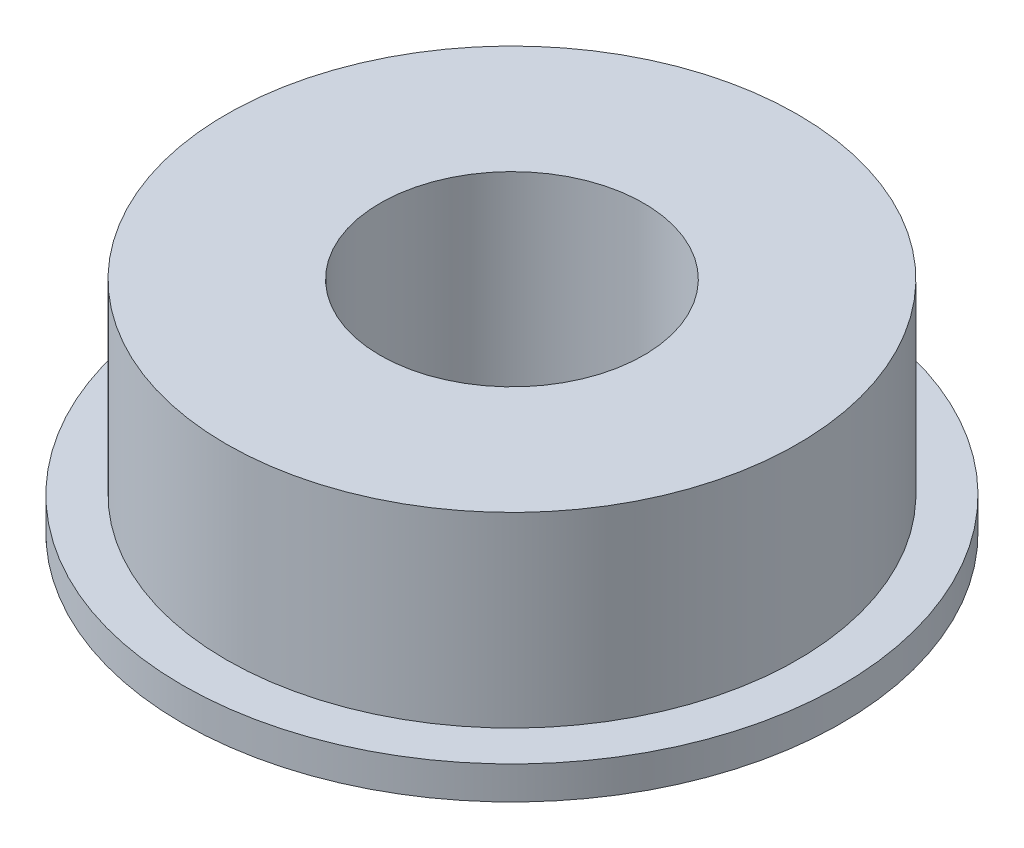
ISO-10303-21;
HEADER;
FILE_DESCRIPTION(('STEP AP214'),'2;1');
FILE_NAME('part.step','',(''),(''),'','','');
FILE_SCHEMA(('AUTOMOTIVE_DESIGN { 1 0 10303 214 1 1 1 1 }'));
ENDSEC;
DATA;
#1=APPLICATION_CONTEXT('core data for automotive mechanical design processes');
#2=APPLICATION_PROTOCOL_DEFINITION('international standard','automotive_design',2000,#1);
#3=PRODUCT_CONTEXT('',#1,'mechanical');
#4=PRODUCT('Part','Part','',(#3));
#5=PRODUCT_RELATED_PRODUCT_CATEGORY('part','',(#4));
#6=PRODUCT_DEFINITION_FORMATION('','',#4);
#7=PRODUCT_DEFINITION_CONTEXT('part definition',#1,'design');
#8=PRODUCT_DEFINITION('design','',#6,#7);
#9=PRODUCT_DEFINITION_SHAPE('','',#8);
#10=(LENGTH_UNIT() NAMED_UNIT(*) SI_UNIT(.MILLI.,.METRE.));
#11=(NAMED_UNIT(*) PLANE_ANGLE_UNIT() SI_UNIT($,.RADIAN.));
#12=(NAMED_UNIT(*) SI_UNIT($,.STERADIAN.) SOLID_ANGLE_UNIT());
#13=UNCERTAINTY_MEASURE_WITH_UNIT(LENGTH_MEASURE(1.E-05),#10,'distance_accuracy_value','');
#14=(GEOMETRIC_REPRESENTATION_CONTEXT(3) GLOBAL_UNCERTAINTY_ASSIGNED_CONTEXT((#13)) GLOBAL_UNIT_ASSIGNED_CONTEXT((#10,
#11,#12)) REPRESENTATION_CONTEXT('',''));
#15=CARTESIAN_POINT('',(0.,0.,0.));
#16=DIRECTION('',(0.,0.,1.));
#17=DIRECTION('',(1.,0.,0.));
#18=AXIS2_PLACEMENT_3D('',#15,#16,#17);
#19=CARTESIAN_POINT('',(0.,133.35,0.));
#20=DIRECTION('',(0.,1.,0.));
#21=DIRECTION('',(0.,0.,1.));
#22=AXIS2_PLACEMENT_3D('',#19,#20,#21);
#23=CYLINDRICAL_SURFACE('',#22,3.);
#24=CARTESIAN_POINT('',(0.,0.,0.));
#25=DIRECTION('',(0.,1.,0.));
#26=DIRECTION('',(0.,0.,1.));
#27=AXIS2_PLACEMENT_3D('',#24,#25,#26);
#28=CIRCLE('',#27,3.);
#29=CARTESIAN_POINT('',(0.,0.,3.));
#30=VERTEX_POINT('',#29);
#31=EDGE_CURVE('E10',#30,#30,#28,.T.);
#32=ORIENTED_EDGE('',*,*,#31,.F.);
#33=EDGE_LOOP('',(#32));
#34=FACE_BOUND('',#33,.T.);
#35=CARTESIAN_POINT('',(0.,5.,0.));
#36=DIRECTION('',(0.,1.,0.));
#37=DIRECTION('',(0.,0.,1.));
#38=AXIS2_PLACEMENT_3D('',#35,#36,#37);
#39=CIRCLE('',#38,3.);
#40=CARTESIAN_POINT('',(0.,5.,3.));
#41=VERTEX_POINT('',#40);
#42=EDGE_CURVE('E52',#41,#41,#39,.T.);
#43=ORIENTED_EDGE('',*,*,#42,.T.);
#44=EDGE_LOOP('',(#43));
#45=FACE_BOUND('',#44,.T.);
#46=ADVANCED_FACE('F30',(#34,#45),#23,.F.);
#47=CARTESIAN_POINT('',(3.,0.,0.));
#48=DIRECTION('',(0.,1.,0.));
#49=DIRECTION('',(0.,0.,1.));
#50=AXIS2_PLACEMENT_3D('',#47,#48,#49);
#51=PLANE('',#50);
#52=CARTESIAN_POINT('',(0.,0.,0.));
#53=DIRECTION('',(0.,1.,0.));
#54=DIRECTION('',(0.,0.,1.));
#55=AXIS2_PLACEMENT_3D('',#52,#53,#54);
#56=CIRCLE('',#55,7.5);
#57=CARTESIAN_POINT('',(0.,0.,7.5));
#58=VERTEX_POINT('',#57);
#59=EDGE_CURVE('E36',#58,#58,#56,.T.);
#60=ORIENTED_EDGE('',*,*,#59,.F.);
#61=EDGE_LOOP('',(#60));
#62=FACE_BOUND('',#61,.T.);
#63=ORIENTED_EDGE('',*,*,#31,.T.);
#64=EDGE_LOOP('',(#63));
#65=FACE_BOUND('',#64,.T.);
#66=ADVANCED_FACE('F77',(#62,#65),#51,.F.);
#67=CARTESIAN_POINT('',(0.,133.35,0.));
#68=DIRECTION('',(0.,1.,0.));
#69=DIRECTION('',(0.,0.,1.));
#70=AXIS2_PLACEMENT_3D('',#67,#68,#69);
#71=CYLINDRICAL_SURFACE('',#70,7.5);
#72=CARTESIAN_POINT('',(0.,0.750000000000001,0.));
#73=DIRECTION('',(0.,1.,0.));
#74=DIRECTION('',(0.,0.,1.));
#75=AXIS2_PLACEMENT_3D('',#72,#73,#74);
#76=CIRCLE('',#75,7.5);
#77=CARTESIAN_POINT('',(0.,0.750000000000001,7.5));
#78=VERTEX_POINT('',#77);
#79=EDGE_CURVE('E40',#78,#78,#76,.T.);
#80=ORIENTED_EDGE('',*,*,#79,.F.);
#81=EDGE_LOOP('',(#80));
#82=FACE_BOUND('',#81,.T.);
#83=ORIENTED_EDGE('',*,*,#59,.T.);
#84=EDGE_LOOP('',(#83));
#85=FACE_BOUND('',#84,.T.);
#86=ADVANCED_FACE('F72',(#82,#85),#71,.T.);
#87=CARTESIAN_POINT('',(7.5,0.75,0.));
#88=DIRECTION('',(0.,-1.,0.));
#89=DIRECTION('',(0.,0.,-1.));
#90=AXIS2_PLACEMENT_3D('',#87,#88,#89);
#91=PLANE('',#90);
#92=CARTESIAN_POINT('',(0.,0.750000000000001,0.));
#93=DIRECTION('',(0.,1.,0.));
#94=DIRECTION('',(0.,0.,1.));
#95=AXIS2_PLACEMENT_3D('',#92,#93,#94);
#96=CIRCLE('',#95,6.5);
#97=CARTESIAN_POINT('',(0.,0.750000000000001,6.5));
#98=VERTEX_POINT('',#97);
#99=EDGE_CURVE('E44',#98,#98,#96,.T.);
#100=ORIENTED_EDGE('',*,*,#99,.F.);
#101=EDGE_LOOP('',(#100));
#102=FACE_BOUND('',#101,.T.);
#103=ORIENTED_EDGE('',*,*,#79,.T.);
#104=EDGE_LOOP('',(#103));
#105=FACE_BOUND('',#104,.T.);
#106=ADVANCED_FACE('F66',(#102,#105),#91,.F.);
#107=CARTESIAN_POINT('',(0.,133.35,0.));
#108=DIRECTION('',(0.,1.,0.));
#109=DIRECTION('',(0.,0.,1.));
#110=AXIS2_PLACEMENT_3D('',#107,#108,#109);
#111=CYLINDRICAL_SURFACE('',#110,6.5);
#112=CARTESIAN_POINT('',(0.,5.,0.));
#113=DIRECTION('',(0.,1.,0.));
#114=DIRECTION('',(0.,0.,1.));
#115=AXIS2_PLACEMENT_3D('',#112,#113,#114);
#116=CIRCLE('',#115,6.5);
#117=CARTESIAN_POINT('',(0.,5.,6.5));
#118=VERTEX_POINT('',#117);
#119=EDGE_CURVE('E49',#118,#118,#116,.T.);
#120=ORIENTED_EDGE('',*,*,#119,.F.);
#121=EDGE_LOOP('',(#120));
#122=FACE_BOUND('',#121,.T.);
#123=ORIENTED_EDGE('',*,*,#99,.T.);
#124=EDGE_LOOP('',(#123));
#125=FACE_BOUND('',#124,.T.);
#126=ADVANCED_FACE('F60',(#122,#125),#111,.T.);
#127=CARTESIAN_POINT('',(6.5,5.,0.));
#128=DIRECTION('',(0.,-1.,0.));
#129=DIRECTION('',(0.,0.,-1.));
#130=AXIS2_PLACEMENT_3D('',#127,#128,#129);
#131=PLANE('',#130);
#132=ORIENTED_EDGE('',*,*,#42,.F.);
#133=EDGE_LOOP('',(#132));
#134=FACE_BOUND('',#133,.T.);
#135=ORIENTED_EDGE('',*,*,#119,.T.);
#136=EDGE_LOOP('',(#135));
#137=FACE_BOUND('',#136,.T.);
#138=ADVANCED_FACE('F57',(#134,#137),#131,.F.);
#139=CLOSED_SHELL('',(#46,#66,#86,#106,#126,#138));
#140=MANIFOLD_SOLID_BREP('B2',#139);
#141=ADVANCED_BREP_SHAPE_REPRESENTATION('',(#18,#140),#14);
#142=SHAPE_DEFINITION_REPRESENTATION(#9,#141);
ENDSEC;
END-ISO-10303-21;
